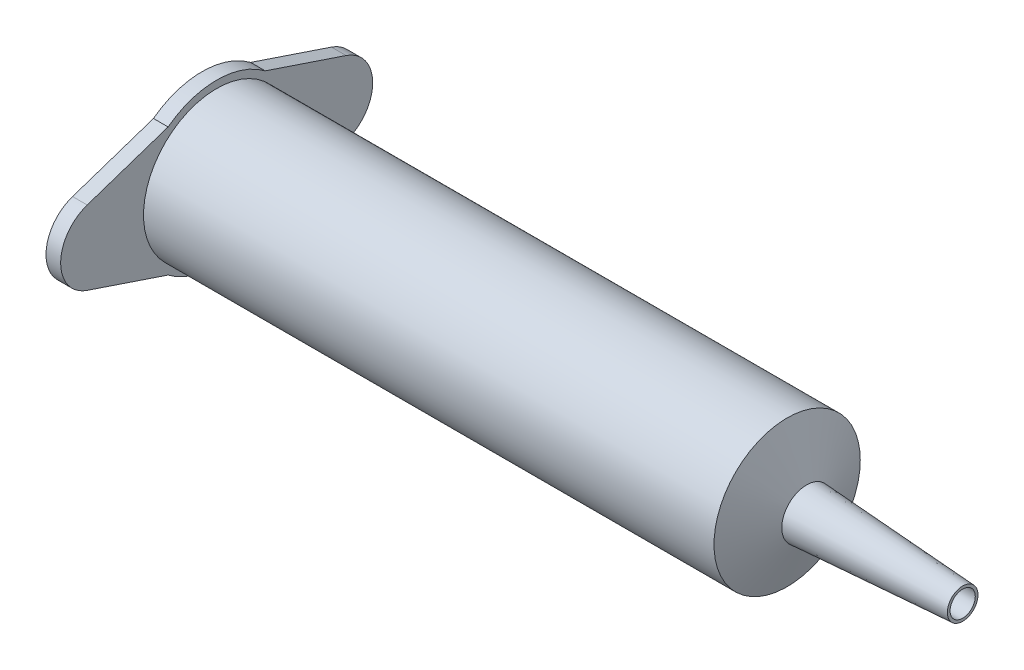
ISO-10303-21;
HEADER;
FILE_DESCRIPTION(('STEP AP214'),'2;1');
FILE_NAME('part.step','',(''),(''),'','','');
FILE_SCHEMA(('AUTOMOTIVE_DESIGN { 1 0 10303 214 1 1 1 1 }'));
ENDSEC;
DATA;
#1=APPLICATION_CONTEXT('core data for automotive mechanical design processes');
#2=APPLICATION_PROTOCOL_DEFINITION('international standard','automotive_design',2000,#1);
#3=PRODUCT_CONTEXT('',#1,'mechanical');
#4=PRODUCT('Part','Part','',(#3));
#5=PRODUCT_RELATED_PRODUCT_CATEGORY('part','',(#4));
#6=PRODUCT_DEFINITION_FORMATION('','',#4);
#7=PRODUCT_DEFINITION_CONTEXT('part definition',#1,'design');
#8=PRODUCT_DEFINITION('design','',#6,#7);
#9=PRODUCT_DEFINITION_SHAPE('','',#8);
#10=(LENGTH_UNIT() NAMED_UNIT(*) SI_UNIT(.MILLI.,.METRE.));
#11=(NAMED_UNIT(*) PLANE_ANGLE_UNIT() SI_UNIT($,.RADIAN.));
#12=(NAMED_UNIT(*) SI_UNIT($,.STERADIAN.) SOLID_ANGLE_UNIT());
#13=UNCERTAINTY_MEASURE_WITH_UNIT(LENGTH_MEASURE(1.E-05),#10,'distance_accuracy_value','');
#14=(GEOMETRIC_REPRESENTATION_CONTEXT(3) GLOBAL_UNCERTAINTY_ASSIGNED_CONTEXT((#13)) GLOBAL_UNIT_ASSIGNED_CONTEXT((#10,
#11,#12)) REPRESENTATION_CONTEXT('',''));
#15=CARTESIAN_POINT('',(0.,0.,0.));
#16=DIRECTION('',(0.,0.,1.));
#17=DIRECTION('',(1.,0.,0.));
#18=AXIS2_PLACEMENT_3D('',#15,#16,#17);
#19=CARTESIAN_POINT('',(117.,0.,0.));
#20=DIRECTION('',(-1.,0.,0.));
#21=DIRECTION('',(0.,0.,1.));
#22=AXIS2_PLACEMENT_3D('',#19,#20,#21);
#23=CYLINDRICAL_SURFACE('',#22,15.);
#24=CARTESIAN_POINT('',(117.,0.,0.));
#25=DIRECTION('',(1.,0.,0.));
#26=DIRECTION('',(0.,0.,-1.));
#27=AXIS2_PLACEMENT_3D('',#24,#25,#26);
#28=CIRCLE('',#27,15.);
#29=CARTESIAN_POINT('',(117.,0.,-15.));
#30=VERTEX_POINT('',#29);
#31=EDGE_CURVE('E11',#30,#30,#28,.T.);
#32=ORIENTED_EDGE('',*,*,#31,.F.);
#33=EDGE_LOOP('',(#32));
#34=FACE_BOUND('',#33,.T.);
#35=CARTESIAN_POINT('',(0.,0.,0.));
#36=DIRECTION('',(1.,0.,0.));
#37=DIRECTION('',(0.,0.,-1.));
#38=AXIS2_PLACEMENT_3D('',#35,#36,#37);
#39=CIRCLE('',#38,15.);
#40=CARTESIAN_POINT('',(0.,0.,-15.));
#41=VERTEX_POINT('',#40);
#42=EDGE_CURVE('E187',#41,#41,#39,.T.);
#43=ORIENTED_EDGE('',*,*,#42,.T.);
#44=EDGE_LOOP('',(#43));
#45=FACE_BOUND('',#44,.T.);
#46=ADVANCED_FACE('F38',(#34,#45),#23,.T.);
#47=CARTESIAN_POINT('',(117.,0.,0.));
#48=DIRECTION('',(-1.,0.,0.));
#49=DIRECTION('',(0.,0.,-1.));
#50=AXIS2_PLACEMENT_3D('',#47,#48,#49);
#51=CONICAL_SURFACE('',#50,15.,1.18682389135615);
#52=CARTESIAN_POINT('',(121.,0.,0.));
#53=DIRECTION('',(1.,0.,0.));
#54=DIRECTION('',(0.,0.,-1.));
#55=AXIS2_PLACEMENT_3D('',#52,#53,#54);
#56=CIRCLE('',#55,5.09965258633475);
#57=CARTESIAN_POINT('',(121.,0.,-5.09965258633475));
#58=VERTEX_POINT('',#57);
#59=EDGE_CURVE('E48',#58,#58,#56,.T.);
#60=ORIENTED_EDGE('',*,*,#59,.F.);
#61=EDGE_LOOP('',(#60));
#62=FACE_BOUND('',#61,.T.);
#63=ORIENTED_EDGE('',*,*,#31,.T.);
#64=EDGE_LOOP('',(#63));
#65=FACE_BOUND('',#64,.T.);
#66=ADVANCED_FACE('F221',(#62,#65),#51,.T.);
#67=CARTESIAN_POINT('',(121.,0.,0.));
#68=DIRECTION('',(-1.,0.,0.));
#69=DIRECTION('',(0.,0.,-1.));
#70=AXIS2_PLACEMENT_3D('',#67,#68,#69);
#71=CONICAL_SURFACE('',#70,5.09965258633475,0.0610865238198017);
#72=CARTESIAN_POINT('',(153.,0.,0.));
#73=DIRECTION('',(1.,0.,0.));
#74=DIRECTION('',(0.,0.,-1.));
#75=AXIS2_PLACEMENT_3D('',#72,#73,#74);
#76=CIRCLE('',#75,3.14244874151925);
#77=CARTESIAN_POINT('',(153.,0.,-3.14244874151925));
#78=VERTEX_POINT('',#77);
#79=EDGE_CURVE('E188',#78,#78,#76,.T.);
#80=ORIENTED_EDGE('',*,*,#79,.F.);
#81=EDGE_LOOP('',(#80));
#82=FACE_BOUND('',#81,.T.);
#83=ORIENTED_EDGE('',*,*,#59,.T.);
#84=EDGE_LOOP('',(#83));
#85=FACE_BOUND('',#84,.T.);
#86=ADVANCED_FACE('F226',(#82,#85),#71,.T.);
#87=CARTESIAN_POINT('',(153.,0.,0.));
#88=DIRECTION('',(1.,0.,0.));
#89=DIRECTION('',(0.,0.,-1.));
#90=AXIS2_PLACEMENT_3D('',#87,#88,#89);
#91=PLANE('',#90);
#92=CARTESIAN_POINT('',(153.,0.,0.));
#93=DIRECTION('',(1.,0.,0.));
#94=DIRECTION('',(0.,0.,-1.));
#95=AXIS2_PLACEMENT_3D('',#92,#93,#94);
#96=CIRCLE('',#95,2.58388695485314);
#97=CARTESIAN_POINT('',(153.,0.,-2.58388695485314));
#98=VERTEX_POINT('',#97);
#99=EDGE_CURVE('E329',#98,#98,#96,.T.);
#100=ORIENTED_EDGE('',*,*,#99,.F.);
#101=EDGE_LOOP('',(#100));
#102=FACE_BOUND('',#101,.T.);
#103=ORIENTED_EDGE('',*,*,#79,.T.);
#104=EDGE_LOOP('',(#103));
#105=FACE_BOUND('',#104,.T.);
#106=ADVANCED_FACE('F233',(#102,#105),#91,.T.);
#107=CARTESIAN_POINT('',(-3.,0.,24.));
#108=DIRECTION('',(1.,0.,0.));
#109=DIRECTION('',(0.,0.,-1.));
#110=AXIS2_PLACEMENT_3D('',#107,#108,#109);
#111=CYLINDRICAL_SURFACE('',#110,8.00000000000001);
#112=CARTESIAN_POINT('',(0.,0.,24.));
#113=DIRECTION('',(-1.,0.,0.));
#114=DIRECTION('',(0.,0.,1.));
#115=AXIS2_PLACEMENT_3D('',#112,#113,#114);
#116=CIRCLE('',#115,8.00000000000001);
#117=CARTESIAN_POINT('',(0.,-7.58367702636969,26.5471244099401));
#118=VERTEX_POINT('',#117);
#119=CARTESIAN_POINT('',(0.,7.58367702636969,26.5471244099401));
#120=VERTEX_POINT('',#119);
#121=EDGE_CURVE('E142',#118,#120,#116,.T.);
#122=ORIENTED_EDGE('',*,*,#121,.T.);
#123=DIRECTION('',(1.,0.,0.));
#124=VECTOR('',#123,1.);
#125=CARTESIAN_POINT('',(-3.,7.58367702636969,26.5471244099401));
#126=LINE('',#125,#124);
#127=CARTESIAN_POINT('',(-3.,7.58367702636969,26.5471244099401));
#128=VERTEX_POINT('',#127);
#129=EDGE_CURVE('E184',#128,#120,#126,.T.);
#130=ORIENTED_EDGE('',*,*,#129,.F.);
#131=CARTESIAN_POINT('',(-3.,0.,24.));
#132=DIRECTION('',(-1.,0.,0.));
#133=DIRECTION('',(0.,0.,1.));
#134=AXIS2_PLACEMENT_3D('',#131,#132,#133);
#135=CIRCLE('',#134,8.00000000000001);
#136=CARTESIAN_POINT('',(-3.,-7.58367702636969,26.5471244099401));
#137=VERTEX_POINT('',#136);
#138=EDGE_CURVE('E165',#137,#128,#135,.T.);
#139=ORIENTED_EDGE('',*,*,#138,.F.);
#140=DIRECTION('',(1.,0.,0.));
#141=VECTOR('',#140,1.);
#142=CARTESIAN_POINT('',(-3.,-7.58367702636969,26.5471244099401));
#143=LINE('',#142,#141);
#144=EDGE_CURVE('E138',#137,#118,#143,.T.);
#145=ORIENTED_EDGE('',*,*,#144,.T.);
#146=EDGE_LOOP('',(#122,#130,#139,#145));
#147=FACE_BOUND('',#146,.T.);
#148=ADVANCED_FACE('F208',(#147),#111,.T.);
#149=CARTESIAN_POINT('',(-3.,7.58367702636969,26.5471244099401));
#150=DIRECTION('',(0.,-0.94795962829621,-0.318390551242511));
#151=DIRECTION('',(0.,0.318390551242511,-0.947959628296211));
#152=AXIS2_PLACEMENT_3D('',#149,#150,#151);
#153=PLANE('',#152);
#154=DIRECTION('',(0.,0.318390551242511,-0.947959628296211));
#155=VECTOR('',#154,1.);
#156=CARTESIAN_POINT('',(0.,7.58367702636969,26.5471244099401));
#157=LINE('',#156,#155);
#158=CARTESIAN_POINT('',(0.,13.1547391821161,9.96013088966471));
#159=VERTEX_POINT('',#158);
#160=EDGE_CURVE('E146',#120,#159,#157,.T.);
#161=ORIENTED_EDGE('',*,*,#160,.T.);
#162=DIRECTION('',(1.,0.,0.));
#163=VECTOR('',#162,1.);
#164=CARTESIAN_POINT('',(-3.,13.1547391821161,9.96013088966471));
#165=LINE('',#164,#163);
#166=CARTESIAN_POINT('',(-3.,13.1547391821161,9.96013088966471));
#167=VERTEX_POINT('',#166);
#168=EDGE_CURVE('E180',#167,#159,#165,.T.);
#169=ORIENTED_EDGE('',*,*,#168,.F.);
#170=DIRECTION('',(0.,0.318390551242511,-0.947959628296211));
#171=VECTOR('',#170,1.);
#172=CARTESIAN_POINT('',(-3.,7.58367702636969,26.5471244099401));
#173=LINE('',#172,#171);
#174=EDGE_CURVE('E101',#128,#167,#173,.T.);
#175=ORIENTED_EDGE('',*,*,#174,.F.);
#176=ORIENTED_EDGE('',*,*,#129,.T.);
#177=EDGE_LOOP('',(#161,#169,#175,#176));
#178=FACE_BOUND('',#177,.T.);
#179=ADVANCED_FACE('F243',(#178),#153,.F.);
#180=CARTESIAN_POINT('',(-3.,0.,0.));
#181=DIRECTION('',(1.,0.,0.));
#182=DIRECTION('',(0.,0.,-1.));
#183=AXIS2_PLACEMENT_3D('',#180,#181,#182);
#184=CYLINDRICAL_SURFACE('',#183,16.5000415238494);
#185=CARTESIAN_POINT('',(0.,0.,0.));
#186=DIRECTION('',(-1.,0.,0.));
#187=DIRECTION('',(0.,0.,1.));
#188=AXIS2_PLACEMENT_3D('',#185,#186,#187);
#189=CIRCLE('',#188,16.5000415238494);
#190=CARTESIAN_POINT('',(0.,13.1547391821161,-9.96013088966471));
#191=VERTEX_POINT('',#190);
#192=EDGE_CURVE('E150',#159,#191,#189,.T.);
#193=ORIENTED_EDGE('',*,*,#192,.T.);
#194=DIRECTION('',(1.,0.,0.));
#195=VECTOR('',#194,1.);
#196=CARTESIAN_POINT('',(-3.,13.1547391821161,-9.96013088966471));
#197=LINE('',#196,#195);
#198=CARTESIAN_POINT('',(-3.,13.1547391821161,-9.96013088966471));
#199=VERTEX_POINT('',#198);
#200=EDGE_CURVE('E176',#199,#191,#197,.T.);
#201=ORIENTED_EDGE('',*,*,#200,.F.);
#202=CARTESIAN_POINT('',(-3.,0.,0.));
#203=DIRECTION('',(-1.,0.,0.));
#204=DIRECTION('',(0.,0.,1.));
#205=AXIS2_PLACEMENT_3D('',#202,#203,#204);
#206=CIRCLE('',#205,16.5000415238494);
#207=EDGE_CURVE('E345',#167,#199,#206,.T.);
#208=ORIENTED_EDGE('',*,*,#207,.F.);
#209=ORIENTED_EDGE('',*,*,#168,.T.);
#210=EDGE_LOOP('',(#193,#201,#208,#209));
#211=FACE_BOUND('',#210,.T.);
#212=ADVANCED_FACE('F246',(#211),#184,.T.);
#213=CARTESIAN_POINT('',(-3.,13.1547391821161,-9.96013088966471));
#214=DIRECTION('',(0.,-0.94795962829621,0.318390551242512));
#215=DIRECTION('',(0.,-0.318390551242512,-0.94795962829621));
#216=AXIS2_PLACEMENT_3D('',#213,#214,#215);
#217=PLANE('',#216);
#218=DIRECTION('',(0.,-0.318390551242512,-0.94795962829621));
#219=VECTOR('',#218,1.);
#220=CARTESIAN_POINT('',(0.,13.1547391821161,-9.96013088966471));
#221=LINE('',#220,#219);
#222=CARTESIAN_POINT('',(0.,7.58367702636967,-26.5471244099401));
#223=VERTEX_POINT('',#222);
#224=EDGE_CURVE('E153',#191,#223,#221,.T.);
#225=ORIENTED_EDGE('',*,*,#224,.T.);
#226=DIRECTION('',(1.,0.,0.));
#227=VECTOR('',#226,1.);
#228=CARTESIAN_POINT('',(-3.,7.58367702636967,-26.5471244099401));
#229=LINE('',#228,#227);
#230=CARTESIAN_POINT('',(-3.,7.58367702636967,-26.5471244099401));
#231=VERTEX_POINT('',#230);
#232=EDGE_CURVE('E172',#231,#223,#229,.T.);
#233=ORIENTED_EDGE('',*,*,#232,.F.);
#234=DIRECTION('',(0.,-0.318390551242512,-0.94795962829621));
#235=VECTOR('',#234,1.);
#236=CARTESIAN_POINT('',(-3.,13.1547391821161,-9.96013088966471));
#237=LINE('',#236,#235);
#238=EDGE_CURVE('E348',#199,#231,#237,.T.);
#239=ORIENTED_EDGE('',*,*,#238,.F.);
#240=ORIENTED_EDGE('',*,*,#200,.T.);
#241=EDGE_LOOP('',(#225,#233,#239,#240));
#242=FACE_BOUND('',#241,.T.);
#243=ADVANCED_FACE('F249',(#242),#217,.F.);
#244=CARTESIAN_POINT('',(-3.,0.,-24.));
#245=DIRECTION('',(1.,0.,0.));
#246=DIRECTION('',(0.,0.,-1.));
#247=AXIS2_PLACEMENT_3D('',#244,#245,#246);
#248=CYLINDRICAL_SURFACE('',#247,8.);
#249=CARTESIAN_POINT('',(0.,0.,-24.));
#250=DIRECTION('',(-1.,0.,0.));
#251=DIRECTION('',(0.,0.,1.));
#252=AXIS2_PLACEMENT_3D('',#249,#250,#251);
#253=CIRCLE('',#252,8.);
#254=CARTESIAN_POINT('',(0.,-7.58367702636968,-26.5471244099401));
#255=VERTEX_POINT('',#254);
#256=EDGE_CURVE('E156',#223,#255,#253,.T.);
#257=ORIENTED_EDGE('',*,*,#256,.T.);
#258=DIRECTION('',(1.,0.,0.));
#259=VECTOR('',#258,1.);
#260=CARTESIAN_POINT('',(-3.,-7.58367702636968,-26.5471244099401));
#261=LINE('',#260,#259);
#262=CARTESIAN_POINT('',(-3.,-7.58367702636968,-26.5471244099401));
#263=VERTEX_POINT('',#262);
#264=EDGE_CURVE('E131',#263,#255,#261,.T.);
#265=ORIENTED_EDGE('',*,*,#264,.F.);
#266=CARTESIAN_POINT('',(-3.,0.,-24.));
#267=DIRECTION('',(-1.,0.,0.));
#268=DIRECTION('',(0.,0.,1.));
#269=AXIS2_PLACEMENT_3D('',#266,#267,#268);
#270=CIRCLE('',#269,8.);
#271=EDGE_CURVE('E120',#231,#263,#270,.T.);
#272=ORIENTED_EDGE('',*,*,#271,.F.);
#273=ORIENTED_EDGE('',*,*,#232,.T.);
#274=EDGE_LOOP('',(#257,#265,#272,#273));
#275=FACE_BOUND('',#274,.T.);
#276=ADVANCED_FACE('F253',(#275),#248,.T.);
#277=CARTESIAN_POINT('',(-3.,-7.58367702636968,-26.5471244099401));
#278=DIRECTION('',(0.,0.94795962829621,0.318390551242512));
#279=DIRECTION('',(0.,-0.318390551242513,0.94795962829621));
#280=AXIS2_PLACEMENT_3D('',#277,#278,#279);
#281=PLANE('',#280);
#282=DIRECTION('',(0.,-0.318390551242512,0.94795962829621));
#283=VECTOR('',#282,1.);
#284=CARTESIAN_POINT('',(0.,-7.58367702636968,-26.5471244099401));
#285=LINE('',#284,#283);
#286=CARTESIAN_POINT('',(0.,-13.1547391821161,-9.9601308896647));
#287=VERTEX_POINT('',#286);
#288=EDGE_CURVE('E129',#255,#287,#285,.T.);
#289=ORIENTED_EDGE('',*,*,#288,.T.);
#290=DIRECTION('',(1.,0.,0.));
#291=VECTOR('',#290,1.);
#292=CARTESIAN_POINT('',(-3.,-13.1547391821161,-9.9601308896647));
#293=LINE('',#292,#291);
#294=CARTESIAN_POINT('',(-3.,-13.1547391821161,-9.9601308896647));
#295=VERTEX_POINT('',#294);
#296=EDGE_CURVE('E126',#295,#287,#293,.T.);
#297=ORIENTED_EDGE('',*,*,#296,.F.);
#298=DIRECTION('',(0.,-0.318390551242512,0.94795962829621));
#299=VECTOR('',#298,1.);
#300=CARTESIAN_POINT('',(-3.,-7.58367702636968,-26.5471244099401));
#301=LINE('',#300,#299);
#302=EDGE_CURVE('E114',#263,#295,#301,.T.);
#303=ORIENTED_EDGE('',*,*,#302,.F.);
#304=ORIENTED_EDGE('',*,*,#264,.T.);
#305=EDGE_LOOP('',(#289,#297,#303,#304));
#306=FACE_BOUND('',#305,.T.);
#307=ADVANCED_FACE('F127',(#306),#281,.F.);
#308=CARTESIAN_POINT('',(-3.,0.,0.));
#309=DIRECTION('',(1.,0.,0.));
#310=DIRECTION('',(0.,0.,-1.));
#311=AXIS2_PLACEMENT_3D('',#308,#309,#310);
#312=CYLINDRICAL_SURFACE('',#311,16.5000415238494);
#313=CARTESIAN_POINT('',(0.,0.,0.));
#314=DIRECTION('',(-1.,0.,0.));
#315=DIRECTION('',(0.,0.,1.));
#316=AXIS2_PLACEMENT_3D('',#313,#314,#315);
#317=CIRCLE('',#316,16.5000415238494);
#318=CARTESIAN_POINT('',(0.,-13.1547391821161,9.96013088966471));
#319=VERTEX_POINT('',#318);
#320=EDGE_CURVE('E86',#287,#319,#317,.T.);
#321=ORIENTED_EDGE('',*,*,#320,.T.);
#322=DIRECTION('',(1.,0.,0.));
#323=VECTOR('',#322,1.);
#324=CARTESIAN_POINT('',(-3.,-13.1547391821161,9.96013088966471));
#325=LINE('',#324,#323);
#326=CARTESIAN_POINT('',(-3.,-13.1547391821161,9.96013088966471));
#327=VERTEX_POINT('',#326);
#328=EDGE_CURVE('E132',#327,#319,#325,.T.);
#329=ORIENTED_EDGE('',*,*,#328,.F.);
#330=CARTESIAN_POINT('',(-3.,0.,0.));
#331=DIRECTION('',(-1.,0.,0.));
#332=DIRECTION('',(0.,0.,1.));
#333=AXIS2_PLACEMENT_3D('',#330,#331,#332);
#334=CIRCLE('',#333,16.5000415238494);
#335=EDGE_CURVE('E118',#295,#327,#334,.T.);
#336=ORIENTED_EDGE('',*,*,#335,.F.);
#337=ORIENTED_EDGE('',*,*,#296,.T.);
#338=EDGE_LOOP('',(#321,#329,#336,#337));
#339=FACE_BOUND('',#338,.T.);
#340=ADVANCED_FACE('F134',(#339),#312,.T.);
#341=CARTESIAN_POINT('',(-3.,-13.1547391821161,9.96013088966471));
#342=DIRECTION('',(0.,0.94795962829621,-0.318390551242512));
#343=DIRECTION('',(0.,0.318390551242512,0.94795962829621));
#344=AXIS2_PLACEMENT_3D('',#341,#342,#343);
#345=PLANE('',#344);
#346=DIRECTION('',(0.,0.318390551242512,0.94795962829621));
#347=VECTOR('',#346,1.);
#348=CARTESIAN_POINT('',(0.,-13.1547391821161,9.96013088966471));
#349=LINE('',#348,#347);
#350=EDGE_CURVE('E92',#319,#118,#349,.T.);
#351=ORIENTED_EDGE('',*,*,#350,.T.);
#352=ORIENTED_EDGE('',*,*,#144,.F.);
#353=DIRECTION('',(0.,0.318390551242512,0.94795962829621));
#354=VECTOR('',#353,1.);
#355=CARTESIAN_POINT('',(-3.,-13.1547391821161,9.96013088966471));
#356=LINE('',#355,#354);
#357=EDGE_CURVE('E57',#327,#137,#356,.T.);
#358=ORIENTED_EDGE('',*,*,#357,.F.);
#359=ORIENTED_EDGE('',*,*,#328,.T.);
#360=EDGE_LOOP('',(#351,#352,#358,#359));
#361=FACE_BOUND('',#360,.T.);
#362=ADVANCED_FACE('F210',(#361),#345,.F.);
#363=CARTESIAN_POINT('',(-3.,0.,24.));
#364=DIRECTION('',(-1.,0.,0.));
#365=DIRECTION('',(0.,0.,1.));
#366=AXIS2_PLACEMENT_3D('',#363,#364,#365);
#367=PLANE('',#366);
#368=CARTESIAN_POINT('',(-3.,0.,0.));
#369=DIRECTION('',(-1.,0.,0.));
#370=DIRECTION('',(0.,0.,1.));
#371=AXIS2_PLACEMENT_3D('',#368,#369,#370);
#372=CIRCLE('',#371,14.);
#373=CARTESIAN_POINT('',(-3.,0.,14.));
#374=VERTEX_POINT('',#373);
#375=EDGE_CURVE('E333',#374,#374,#372,.T.);
#376=ORIENTED_EDGE('',*,*,#375,.F.);
#377=EDGE_LOOP('',(#376));
#378=FACE_BOUND('',#377,.T.);
#379=ORIENTED_EDGE('',*,*,#138,.T.);
#380=ORIENTED_EDGE('',*,*,#174,.T.);
#381=ORIENTED_EDGE('',*,*,#207,.T.);
#382=ORIENTED_EDGE('',*,*,#238,.T.);
#383=ORIENTED_EDGE('',*,*,#271,.T.);
#384=ORIENTED_EDGE('',*,*,#302,.T.);
#385=ORIENTED_EDGE('',*,*,#335,.T.);
#386=ORIENTED_EDGE('',*,*,#357,.T.);
#387=EDGE_LOOP('',(#379,#380,#381,#382,#383,#384,#385,#386));
#388=FACE_BOUND('',#387,.T.);
#389=ADVANCED_FACE('F116',(#378,#388),#367,.T.);
#390=CARTESIAN_POINT('',(0.,0.,24.));
#391=DIRECTION('',(-1.,0.,0.));
#392=DIRECTION('',(0.,0.,1.));
#393=AXIS2_PLACEMENT_3D('',#390,#391,#392);
#394=PLANE('',#393);
#395=ORIENTED_EDGE('',*,*,#42,.F.);
#396=EDGE_LOOP('',(#395));
#397=FACE_BOUND('',#396,.T.);
#398=ORIENTED_EDGE('',*,*,#121,.F.);
#399=ORIENTED_EDGE('',*,*,#350,.F.);
#400=ORIENTED_EDGE('',*,*,#320,.F.);
#401=ORIENTED_EDGE('',*,*,#288,.F.);
#402=ORIENTED_EDGE('',*,*,#256,.F.);
#403=ORIENTED_EDGE('',*,*,#224,.F.);
#404=ORIENTED_EDGE('',*,*,#192,.F.);
#405=ORIENTED_EDGE('',*,*,#160,.F.);
#406=EDGE_LOOP('',(#398,#399,#400,#401,#402,#403,#404,#405));
#407=FACE_BOUND('',#406,.T.);
#408=ADVANCED_FACE('F199',(#397,#407),#394,.F.);
#409=CARTESIAN_POINT('',(114.,0.,0.));
#410=DIRECTION('',(-1.,0.,0.));
#411=DIRECTION('',(0.,0.,1.));
#412=AXIS2_PLACEMENT_3D('',#409,#410,#411);
#413=CYLINDRICAL_SURFACE('',#412,14.);
#414=CARTESIAN_POINT('',(114.,0.,0.));
#415=DIRECTION('',(-1.,0.,0.));
#416=DIRECTION('',(0.,0.,1.));
#417=AXIS2_PLACEMENT_3D('',#414,#415,#416);
#418=CIRCLE('',#417,14.);
#419=CARTESIAN_POINT('',(114.,0.,14.));
#420=VERTEX_POINT('',#419);
#421=EDGE_CURVE('E147',#420,#420,#418,.T.);
#422=ORIENTED_EDGE('',*,*,#421,.F.);
#423=EDGE_LOOP('',(#422));
#424=FACE_BOUND('',#423,.T.);
#425=ORIENTED_EDGE('',*,*,#375,.T.);
#426=EDGE_LOOP('',(#425));
#427=FACE_BOUND('',#426,.T.);
#428=ADVANCED_FACE('F202',(#424,#427),#413,.F.);
#429=CARTESIAN_POINT('',(114.,0.,0.));
#430=DIRECTION('',(-1.,0.,0.));
#431=DIRECTION('',(0.,0.,1.));
#432=AXIS2_PLACEMENT_3D('',#429,#430,#431);
#433=PLANE('',#432);
#434=CARTESIAN_POINT('',(114.,0.,0.));
#435=DIRECTION('',(-1.,0.,0.));
#436=DIRECTION('',(0.,0.,1.));
#437=AXIS2_PLACEMENT_3D('',#434,#435,#436);
#438=CIRCLE('',#437,2.58388695485314);
#439=CARTESIAN_POINT('',(114.,0.,2.58388695485314));
#440=VERTEX_POINT('',#439);
#441=EDGE_CURVE('E41',#440,#440,#438,.T.);
#442=ORIENTED_EDGE('',*,*,#441,.F.);
#443=EDGE_LOOP('',(#442));
#444=FACE_BOUND('',#443,.T.);
#445=ORIENTED_EDGE('',*,*,#421,.T.);
#446=EDGE_LOOP('',(#445));
#447=FACE_BOUND('',#446,.T.);
#448=ADVANCED_FACE('F292',(#444,#447),#433,.T.);
#449=CARTESIAN_POINT('',(36.,0.,0.));
#450=DIRECTION('',(1.,0.,0.));
#451=DIRECTION('',(0.,0.,-1.));
#452=AXIS2_PLACEMENT_3D('',#449,#450,#451);
#453=CYLINDRICAL_SURFACE('',#452,2.58388695485314);
#454=ORIENTED_EDGE('',*,*,#441,.T.);
#455=EDGE_LOOP('',(#454));
#456=FACE_BOUND('',#455,.T.);
#457=ORIENTED_EDGE('',*,*,#99,.T.);
#458=EDGE_LOOP('',(#457));
#459=FACE_BOUND('',#458,.T.);
#460=ADVANCED_FACE('F310',(#456,#459),#453,.F.);
#461=CLOSED_SHELL('',(#46,#66,#86,#106,#148,#179,#212,#243,#276,#307,#340,#362,#389,#408,#428,
#448,#460));
#462=MANIFOLD_SOLID_BREP('B2',#461);
#463=ADVANCED_BREP_SHAPE_REPRESENTATION('',(#18,#462),#14);
#464=SHAPE_DEFINITION_REPRESENTATION(#9,#463);
ENDSEC;
END-ISO-10303-21;
